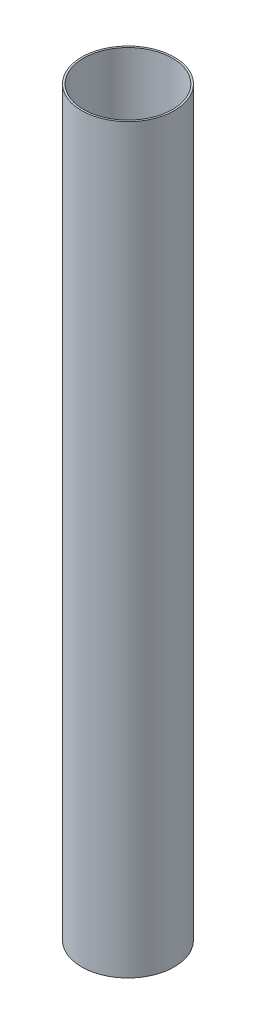
ISO-10303-21;
HEADER;
FILE_DESCRIPTION(('STEP AP214'),'2;1');
FILE_NAME('part.step','',(''),(''),'','','');
FILE_SCHEMA(('AUTOMOTIVE_DESIGN { 1 0 10303 214 1 1 1 1 }'));
ENDSEC;
DATA;
#1=APPLICATION_CONTEXT('core data for automotive mechanical design processes');
#2=APPLICATION_PROTOCOL_DEFINITION('international standard','automotive_design',2000,#1);
#3=PRODUCT_CONTEXT('',#1,'mechanical');
#4=PRODUCT('Part','Part','',(#3));
#5=PRODUCT_RELATED_PRODUCT_CATEGORY('part','',(#4));
#6=PRODUCT_DEFINITION_FORMATION('','',#4);
#7=PRODUCT_DEFINITION_CONTEXT('part definition',#1,'design');
#8=PRODUCT_DEFINITION('design','',#6,#7);
#9=PRODUCT_DEFINITION_SHAPE('','',#8);
#10=(LENGTH_UNIT() NAMED_UNIT(*) SI_UNIT(.MILLI.,.METRE.));
#11=(NAMED_UNIT(*) PLANE_ANGLE_UNIT() SI_UNIT($,.RADIAN.));
#12=(NAMED_UNIT(*) SI_UNIT($,.STERADIAN.) SOLID_ANGLE_UNIT());
#13=UNCERTAINTY_MEASURE_WITH_UNIT(LENGTH_MEASURE(1.E-05),#10,'distance_accuracy_value','');
#14=(GEOMETRIC_REPRESENTATION_CONTEXT(3) GLOBAL_UNCERTAINTY_ASSIGNED_CONTEXT((#13)) GLOBAL_UNIT_ASSIGNED_CONTEXT((#10,
#11,#12)) REPRESENTATION_CONTEXT('',''));
#15=CARTESIAN_POINT('',(0.,0.,0.));
#16=DIRECTION('',(0.,0.,1.));
#17=DIRECTION('',(1.,0.,0.));
#18=AXIS2_PLACEMENT_3D('',#15,#16,#17);
#19=CARTESIAN_POINT('',(0.,100.,0.));
#20=DIRECTION('',(0.,1.,0.));
#21=DIRECTION('',(0.,0.,1.));
#22=AXIS2_PLACEMENT_3D('',#19,#20,#21);
#23=CYLINDRICAL_SURFACE('',#22,12.5);
#24=CARTESIAN_POINT('',(0.,-100.,0.));
#25=DIRECTION('',(0.,1.,0.));
#26=DIRECTION('',(0.,0.,1.));
#27=AXIS2_PLACEMENT_3D('',#24,#25,#26);
#28=CIRCLE('',#27,12.5);
#29=CARTESIAN_POINT('',(0.,-100.,12.5));
#30=VERTEX_POINT('',#29);
#31=EDGE_CURVE('E44',#30,#30,#28,.T.);
#32=ORIENTED_EDGE('',*,*,#31,.T.);
#33=EDGE_LOOP('',(#32));
#34=FACE_BOUND('',#33,.T.);
#35=CARTESIAN_POINT('',(0.,100.,0.));
#36=DIRECTION('',(0.,1.,0.));
#37=DIRECTION('',(0.,0.,1.));
#38=AXIS2_PLACEMENT_3D('',#35,#36,#37);
#39=CIRCLE('',#38,12.5);
#40=CARTESIAN_POINT('',(0.,100.,12.5));
#41=VERTEX_POINT('',#40);
#42=EDGE_CURVE('E10',#41,#41,#39,.T.);
#43=ORIENTED_EDGE('',*,*,#42,.F.);
#44=EDGE_LOOP('',(#43));
#45=FACE_BOUND('',#44,.T.);
#46=ADVANCED_FACE('F30',(#34,#45),#23,.T.);
#47=CARTESIAN_POINT('',(-12.5,100.,0.));
#48=DIRECTION('',(0.,-1.,0.));
#49=DIRECTION('',(0.,0.,-1.));
#50=AXIS2_PLACEMENT_3D('',#47,#48,#49);
#51=PLANE('',#50);
#52=CARTESIAN_POINT('',(0.,100.,0.));
#53=DIRECTION('',(0.,1.,0.));
#54=DIRECTION('',(0.,0.,1.));
#55=AXIS2_PLACEMENT_3D('',#52,#53,#54);
#56=CIRCLE('',#55,12.);
#57=CARTESIAN_POINT('',(0.,100.,12.));
#58=VERTEX_POINT('',#57);
#59=EDGE_CURVE('E36',#58,#58,#56,.T.);
#60=ORIENTED_EDGE('',*,*,#59,.F.);
#61=EDGE_LOOP('',(#60));
#62=FACE_BOUND('',#61,.T.);
#63=ORIENTED_EDGE('',*,*,#42,.T.);
#64=EDGE_LOOP('',(#63));
#65=FACE_BOUND('',#64,.T.);
#66=ADVANCED_FACE('F60',(#62,#65),#51,.F.);
#67=CARTESIAN_POINT('',(0.,100.,0.));
#68=DIRECTION('',(0.,1.,0.));
#69=DIRECTION('',(0.,0.,1.));
#70=AXIS2_PLACEMENT_3D('',#67,#68,#69);
#71=CYLINDRICAL_SURFACE('',#70,12.);
#72=CARTESIAN_POINT('',(0.,-100.,0.));
#73=DIRECTION('',(0.,1.,0.));
#74=DIRECTION('',(0.,0.,1.));
#75=AXIS2_PLACEMENT_3D('',#72,#73,#74);
#76=CIRCLE('',#75,12.);
#77=CARTESIAN_POINT('',(0.,-100.,12.));
#78=VERTEX_POINT('',#77);
#79=EDGE_CURVE('E40',#78,#78,#76,.T.);
#80=ORIENTED_EDGE('',*,*,#79,.F.);
#81=EDGE_LOOP('',(#80));
#82=FACE_BOUND('',#81,.T.);
#83=ORIENTED_EDGE('',*,*,#59,.T.);
#84=EDGE_LOOP('',(#83));
#85=FACE_BOUND('',#84,.T.);
#86=ADVANCED_FACE('F55',(#82,#85),#71,.F.);
#87=CARTESIAN_POINT('',(-12.,-100.,0.));
#88=DIRECTION('',(0.,1.,0.));
#89=DIRECTION('',(0.,0.,1.));
#90=AXIS2_PLACEMENT_3D('',#87,#88,#89);
#91=PLANE('',#90);
#92=ORIENTED_EDGE('',*,*,#31,.F.);
#93=EDGE_LOOP('',(#92));
#94=FACE_BOUND('',#93,.T.);
#95=ORIENTED_EDGE('',*,*,#79,.T.);
#96=EDGE_LOOP('',(#95));
#97=FACE_BOUND('',#96,.T.);
#98=ADVANCED_FACE('F52',(#94,#97),#91,.F.);
#99=CLOSED_SHELL('',(#46,#66,#86,#98));
#100=MANIFOLD_SOLID_BREP('B2',#99);
#101=ADVANCED_BREP_SHAPE_REPRESENTATION('',(#18,#100),#14);
#102=SHAPE_DEFINITION_REPRESENTATION(#9,#101);
ENDSEC;
END-ISO-10303-21;
